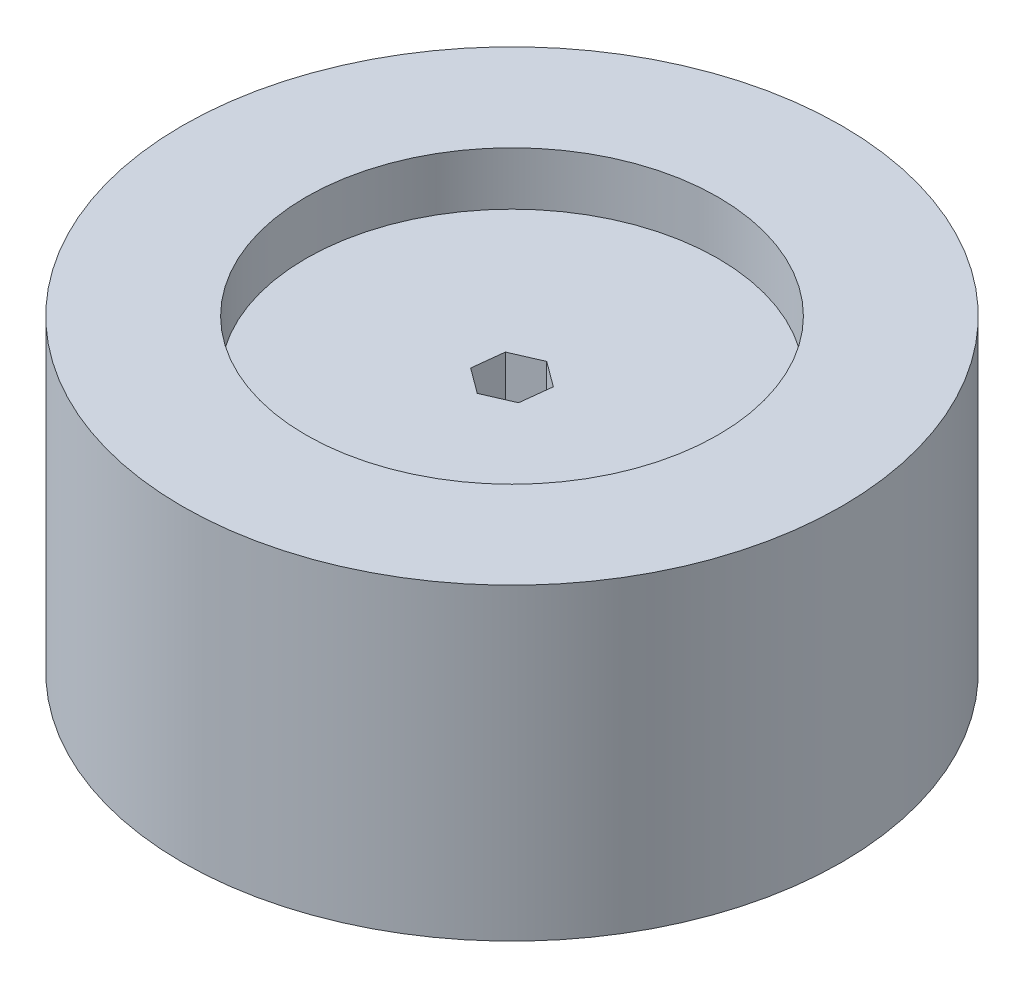
ISO-10303-21;
HEADER;
FILE_DESCRIPTION(('STEP AP214'),'2;1');
FILE_NAME('part.step','',(''),(''),'','','');
FILE_SCHEMA(('AUTOMOTIVE_DESIGN { 1 0 10303 214 1 1 1 1 }'));
ENDSEC;
DATA;
#1=APPLICATION_CONTEXT('core data for automotive mechanical design processes');
#2=APPLICATION_PROTOCOL_DEFINITION('international standard','automotive_design',2000,#1);
#3=PRODUCT_CONTEXT('',#1,'mechanical');
#4=PRODUCT('Part','Part','',(#3));
#5=PRODUCT_RELATED_PRODUCT_CATEGORY('part','',(#4));
#6=PRODUCT_DEFINITION_FORMATION('','',#4);
#7=PRODUCT_DEFINITION_CONTEXT('part definition',#1,'design');
#8=PRODUCT_DEFINITION('design','',#6,#7);
#9=PRODUCT_DEFINITION_SHAPE('','',#8);
#10=(LENGTH_UNIT() NAMED_UNIT(*) SI_UNIT(.MILLI.,.METRE.));
#11=(NAMED_UNIT(*) PLANE_ANGLE_UNIT() SI_UNIT($,.RADIAN.));
#12=(NAMED_UNIT(*) SI_UNIT($,.STERADIAN.) SOLID_ANGLE_UNIT());
#13=UNCERTAINTY_MEASURE_WITH_UNIT(LENGTH_MEASURE(1.E-05),#10,'distance_accuracy_value','');
#14=(GEOMETRIC_REPRESENTATION_CONTEXT(3) GLOBAL_UNCERTAINTY_ASSIGNED_CONTEXT((#13)) GLOBAL_UNIT_ASSIGNED_CONTEXT((#10,
#11,#12)) REPRESENTATION_CONTEXT('',''));
#15=CARTESIAN_POINT('',(0.,0.,0.));
#16=DIRECTION('',(0.,0.,1.));
#17=DIRECTION('',(1.,0.,0.));
#18=AXIS2_PLACEMENT_3D('',#15,#16,#17);
#19=CARTESIAN_POINT('',(3.06476739775482,16.7,2.26433230725068));
#20=DIRECTION('',(-0.993654605654718,0.,-0.112474551171215));
#21=DIRECTION('',(-0.112474551171215,0.,0.993654605654718));
#22=AXIS2_PLACEMENT_3D('',#19,#20,#21);
#23=PLANE('',#22);
#24=DIRECTION('',(0.,-1.,0.));
#25=VECTOR('',#24,1.);
#26=CARTESIAN_POINT('',(3.49335299956633,16.7,-1.52200026952066));
#27=LINE('',#26,#25);
#28=CARTESIAN_POINT('',(3.49335299956633,16.7,-1.52200026952066));
#29=VERTEX_POINT('',#28);
#30=CARTESIAN_POINT('',(3.49335299956633,6.45,-1.52200026952066));
#31=VERTEX_POINT('',#30);
#32=EDGE_CURVE('E135',#29,#31,#27,.T.);
#33=ORIENTED_EDGE('',*,*,#32,.T.);
#34=DIRECTION('',(-0.112474551171215,0.,0.993654605654718));
#35=VECTOR('',#34,1.);
#36=CARTESIAN_POINT('',(3.06476739775482,6.45,2.26433230725068));
#37=LINE('',#36,#35);
#38=CARTESIAN_POINT('',(3.06476739775482,6.45,2.26433230725068));
#39=VERTEX_POINT('',#38);
#40=EDGE_CURVE('E122',#31,#39,#37,.T.);
#41=ORIENTED_EDGE('',*,*,#40,.T.);
#42=DIRECTION('',(0.,-1.,0.));
#43=VECTOR('',#42,1.);
#44=CARTESIAN_POINT('',(3.06476739775482,16.7,2.26433230725068));
#45=LINE('',#44,#43);
#46=CARTESIAN_POINT('',(3.06476739775482,16.7,2.26433230725068));
#47=VERTEX_POINT('',#46);
#48=EDGE_CURVE('E132',#47,#39,#45,.T.);
#49=ORIENTED_EDGE('',*,*,#48,.F.);
#50=DIRECTION('',(0.112474551171215,0.,-0.993654605654718));
#51=VECTOR('',#50,1.);
#52=CARTESIAN_POINT('',(3.06476739775482,16.7,2.26433230725068));
#53=LINE('',#52,#51);
#54=EDGE_CURVE('E136',#47,#29,#53,.T.);
#55=ORIENTED_EDGE('',*,*,#54,.T.);
#56=EDGE_LOOP('',(#33,#41,#49,#55));
#57=FACE_BOUND('',#56,.T.);
#58=ADVANCED_FACE('F34',(#57),#23,.T.);
#59=CARTESIAN_POINT('',(3.49335299956633,16.7,-1.52200026952066));
#60=DIRECTION('',(-0.594233121420884,0.,0.804292855498787));
#61=DIRECTION('',(0.804292855498787,0.,0.594233121420884));
#62=AXIS2_PLACEMENT_3D('',#59,#60,#61);
#63=PLANE('',#62);
#64=DIRECTION('',(0.,-1.,0.));
#65=VECTOR('',#64,1.);
#66=CARTESIAN_POINT('',(0.428585601811509,16.7,-3.78633257677134));
#67=LINE('',#66,#65);
#68=CARTESIAN_POINT('',(0.428585601811509,16.7,-3.78633257677134));
#69=VERTEX_POINT('',#68);
#70=CARTESIAN_POINT('',(0.428585601811509,6.45,-3.78633257677134));
#71=VERTEX_POINT('',#70);
#72=EDGE_CURVE('E215',#69,#71,#67,.T.);
#73=ORIENTED_EDGE('',*,*,#72,.T.);
#74=DIRECTION('',(0.804292855498787,0.,0.594233121420884));
#75=VECTOR('',#74,1.);
#76=CARTESIAN_POINT('',(3.49335299956633,6.45,-1.52200026952066));
#77=LINE('',#76,#75);
#78=EDGE_CURVE('E137',#71,#31,#77,.T.);
#79=ORIENTED_EDGE('',*,*,#78,.T.);
#80=ORIENTED_EDGE('',*,*,#32,.F.);
#81=DIRECTION('',(-0.804292855498787,0.,-0.594233121420884));
#82=VECTOR('',#81,1.);
#83=CARTESIAN_POINT('',(3.49335299956633,16.7,-1.52200026952066));
#84=LINE('',#83,#82);
#85=EDGE_CURVE('E143',#29,#69,#84,.T.);
#86=ORIENTED_EDGE('',*,*,#85,.T.);
#87=EDGE_LOOP('',(#73,#79,#80,#86));
#88=FACE_BOUND('',#87,.T.);
#89=ADVANCED_FACE('F248',(#88),#63,.T.);
#90=CARTESIAN_POINT('',(0.428585601811509,16.7,-3.78633257677134));
#91=DIRECTION('',(0.399421484233834,0.,0.916767406670002));
#92=DIRECTION('',(0.916767406670002,0.,-0.399421484233834));
#93=AXIS2_PLACEMENT_3D('',#90,#91,#92);
#94=PLANE('',#93);
#95=DIRECTION('',(0.,-1.,0.));
#96=VECTOR('',#95,1.);
#97=CARTESIAN_POINT('',(-3.06476739775481,16.7,-2.26433230725068));
#98=LINE('',#97,#96);
#99=CARTESIAN_POINT('',(-3.06476739775481,16.7,-2.26433230725068));
#100=VERTEX_POINT('',#99);
#101=CARTESIAN_POINT('',(-3.06476739775481,6.45,-2.26433230725068));
#102=VERTEX_POINT('',#101);
#103=EDGE_CURVE('E218',#100,#102,#98,.T.);
#104=ORIENTED_EDGE('',*,*,#103,.T.);
#105=DIRECTION('',(0.916767406670002,0.,-0.399421484233834));
#106=VECTOR('',#105,1.);
#107=CARTESIAN_POINT('',(0.428585601811509,6.45,-3.78633257677134));
#108=LINE('',#107,#106);
#109=EDGE_CURVE('E249',#102,#71,#108,.T.);
#110=ORIENTED_EDGE('',*,*,#109,.T.);
#111=ORIENTED_EDGE('',*,*,#72,.F.);
#112=DIRECTION('',(-0.916767406670002,0.,0.399421484233834));
#113=VECTOR('',#112,1.);
#114=CARTESIAN_POINT('',(0.428585601811509,16.7,-3.78633257677134));
#115=LINE('',#114,#113);
#116=EDGE_CURVE('E147',#69,#100,#115,.T.);
#117=ORIENTED_EDGE('',*,*,#116,.T.);
#118=EDGE_LOOP('',(#104,#110,#111,#117));
#119=FACE_BOUND('',#118,.T.);
#120=ADVANCED_FACE('F245',(#119),#94,.T.);
#121=CARTESIAN_POINT('',(-3.06476739775481,16.7,-2.26433230725068));
#122=DIRECTION('',(0.993654605654718,0.,0.112474551171216));
#123=DIRECTION('',(0.112474551171216,0.,-0.993654605654718));
#124=AXIS2_PLACEMENT_3D('',#121,#122,#123);
#125=PLANE('',#124);
#126=DIRECTION('',(0.,-1.,0.));
#127=VECTOR('',#126,1.);
#128=CARTESIAN_POINT('',(-3.49335299956633,16.7,1.52200026952066));
#129=LINE('',#128,#127);
#130=CARTESIAN_POINT('',(-3.49335299956633,16.7,1.52200026952066));
#131=VERTEX_POINT('',#130);
#132=CARTESIAN_POINT('',(-3.49335299956633,6.45,1.52200026952066));
#133=VERTEX_POINT('',#132);
#134=EDGE_CURVE('E145',#131,#133,#129,.T.);
#135=ORIENTED_EDGE('',*,*,#134,.T.);
#136=DIRECTION('',(0.112474551171216,0.,-0.993654605654718));
#137=VECTOR('',#136,1.);
#138=CARTESIAN_POINT('',(-3.06476739775481,6.45,-2.26433230725068));
#139=LINE('',#138,#137);
#140=EDGE_CURVE('E229',#133,#102,#139,.T.);
#141=ORIENTED_EDGE('',*,*,#140,.T.);
#142=ORIENTED_EDGE('',*,*,#103,.F.);
#143=DIRECTION('',(-0.112474551171216,0.,0.993654605654718));
#144=VECTOR('',#143,1.);
#145=CARTESIAN_POINT('',(-3.06476739775481,16.7,-2.26433230725068));
#146=LINE('',#145,#144);
#147=EDGE_CURVE('E231',#100,#131,#146,.T.);
#148=ORIENTED_EDGE('',*,*,#147,.T.);
#149=EDGE_LOOP('',(#135,#141,#142,#148));
#150=FACE_BOUND('',#149,.T.);
#151=ADVANCED_FACE('F227',(#150),#125,.T.);
#152=CARTESIAN_POINT('',(-3.49335299956633,16.7,1.52200026952066));
#153=DIRECTION('',(0.594233121420884,0.,-0.804292855498787));
#154=DIRECTION('',(-0.804292855498787,0.,-0.594233121420885));
#155=AXIS2_PLACEMENT_3D('',#152,#153,#154);
#156=PLANE('',#155);
#157=DIRECTION('',(0.,-1.,0.));
#158=VECTOR('',#157,1.);
#159=CARTESIAN_POINT('',(-0.428585601811509,16.7,3.78633257677134));
#160=LINE('',#159,#158);
#161=CARTESIAN_POINT('',(-0.428585601811509,16.7,3.78633257677134));
#162=VERTEX_POINT('',#161);
#163=CARTESIAN_POINT('',(-0.428585601811509,6.45,3.78633257677134));
#164=VERTEX_POINT('',#163);
#165=EDGE_CURVE('E142',#162,#164,#160,.T.);
#166=ORIENTED_EDGE('',*,*,#165,.T.);
#167=DIRECTION('',(-0.804292855498787,0.,-0.594233121420885));
#168=VECTOR('',#167,1.);
#169=CARTESIAN_POINT('',(-3.49335299956633,6.45,1.52200026952066));
#170=LINE('',#169,#168);
#171=EDGE_CURVE('E49',#164,#133,#170,.T.);
#172=ORIENTED_EDGE('',*,*,#171,.T.);
#173=ORIENTED_EDGE('',*,*,#134,.F.);
#174=DIRECTION('',(0.804292855498787,0.,0.594233121420885));
#175=VECTOR('',#174,1.);
#176=CARTESIAN_POINT('',(-3.49335299956633,16.7,1.52200026952066));
#177=LINE('',#176,#175);
#178=EDGE_CURVE('E235',#131,#162,#177,.T.);
#179=ORIENTED_EDGE('',*,*,#178,.T.);
#180=EDGE_LOOP('',(#166,#172,#173,#179));
#181=FACE_BOUND('',#180,.T.);
#182=ADVANCED_FACE('F234',(#181),#156,.T.);
#183=CARTESIAN_POINT('',(-0.428585601811509,16.7,3.78633257677134));
#184=DIRECTION('',(-0.399421484233834,0.,-0.916767406670002));
#185=DIRECTION('',(-0.916767406670002,0.,0.399421484233834));
#186=AXIS2_PLACEMENT_3D('',#183,#184,#185);
#187=PLANE('',#186);
#188=ORIENTED_EDGE('',*,*,#48,.T.);
#189=DIRECTION('',(-0.916767406670002,0.,0.399421484233834));
#190=VECTOR('',#189,1.);
#191=CARTESIAN_POINT('',(-0.428585601811509,6.45,3.78633257677134));
#192=LINE('',#191,#190);
#193=EDGE_CURVE('E11',#39,#164,#192,.T.);
#194=ORIENTED_EDGE('',*,*,#193,.T.);
#195=ORIENTED_EDGE('',*,*,#165,.F.);
#196=DIRECTION('',(0.916767406670002,0.,-0.399421484233834));
#197=VECTOR('',#196,1.);
#198=CARTESIAN_POINT('',(-0.428585601811509,16.7,3.78633257677134));
#199=LINE('',#198,#197);
#200=EDGE_CURVE('E141',#162,#47,#199,.T.);
#201=ORIENTED_EDGE('',*,*,#200,.T.);
#202=EDGE_LOOP('',(#188,#194,#195,#201));
#203=FACE_BOUND('',#202,.T.);
#204=ADVANCED_FACE('F139',(#203),#187,.T.);
#205=CARTESIAN_POINT('',(0.,0.,0.));
#206=DIRECTION('',(0.,1.,0.));
#207=DIRECTION('',(0.,0.,1.));
#208=AXIS2_PLACEMENT_3D('',#205,#206,#207);
#209=PLANE('',#208);
#210=CARTESIAN_POINT('',(0.,0.,0.));
#211=DIRECTION('',(0.,1.,0.));
#212=DIRECTION('',(0.,0.,1.));
#213=AXIS2_PLACEMENT_3D('',#210,#211,#212);
#214=CIRCLE('',#213,25.);
#215=CARTESIAN_POINT('',(0.,0.,-25.));
#216=VERTEX_POINT('',#215);
#217=EDGE_CURVE('E256',#216,#216,#214,.T.);
#218=ORIENTED_EDGE('',*,*,#217,.T.);
#219=EDGE_LOOP('',(#218));
#220=FACE_BOUND('',#219,.T.);
#221=CARTESIAN_POINT('',(0.,0.,0.));
#222=DIRECTION('',(0.,1.,0.));
#223=DIRECTION('',(0.,0.,1.));
#224=AXIS2_PLACEMENT_3D('',#221,#222,#223);
#225=CIRCLE('',#224,40.);
#226=CARTESIAN_POINT('',(0.,0.,40.));
#227=VERTEX_POINT('',#226);
#228=EDGE_CURVE('E192',#227,#227,#225,.T.);
#229=ORIENTED_EDGE('',*,*,#228,.F.);
#230=EDGE_LOOP('',(#229));
#231=FACE_BOUND('',#230,.T.);
#232=ADVANCED_FACE('F282',(#220,#231),#209,.F.);
#233=CARTESIAN_POINT('',(0.,0.,0.));
#234=DIRECTION('',(0.,1.,0.));
#235=DIRECTION('',(0.,0.,1.));
#236=AXIS2_PLACEMENT_3D('',#233,#234,#235);
#237=CYLINDRICAL_SURFACE('',#236,1.5);
#238=CARTESIAN_POINT('',(0.,20.7,0.));
#239=DIRECTION('',(0.,1.,0.));
#240=DIRECTION('',(0.,0.,1.));
#241=AXIS2_PLACEMENT_3D('',#238,#239,#240);
#242=CIRCLE('',#241,1.5);
#243=CARTESIAN_POINT('',(0.,20.7,1.5));
#244=VERTEX_POINT('',#243);
#245=EDGE_CURVE('E151',#244,#244,#242,.T.);
#246=ORIENTED_EDGE('',*,*,#245,.T.);
#247=EDGE_LOOP('',(#246));
#248=FACE_BOUND('',#247,.T.);
#249=CARTESIAN_POINT('',(0.,16.7,0.));
#250=DIRECTION('',(0.,-1.,0.));
#251=DIRECTION('',(0.,0.,-1.));
#252=AXIS2_PLACEMENT_3D('',#249,#250,#251);
#253=CIRCLE('',#252,1.5);
#254=CARTESIAN_POINT('',(0.,16.7,-1.5));
#255=VERTEX_POINT('',#254);
#256=EDGE_CURVE('E155',#255,#255,#253,.F.);
#257=ORIENTED_EDGE('',*,*,#256,.F.);
#258=EDGE_LOOP('',(#257));
#259=FACE_BOUND('',#258,.T.);
#260=ADVANCED_FACE('F279',(#248,#259),#237,.F.);
#261=CARTESIAN_POINT('',(0.,37.4,0.));
#262=DIRECTION('',(0.,-1.,0.));
#263=DIRECTION('',(0.,0.,-1.));
#264=AXIS2_PLACEMENT_3D('',#261,#262,#263);
#265=CYLINDRICAL_SURFACE('',#264,40.);
#266=CARTESIAN_POINT('',(0.,37.4,0.));
#267=DIRECTION('',(0.,1.,0.));
#268=DIRECTION('',(0.,0.,1.));
#269=AXIS2_PLACEMENT_3D('',#266,#267,#268);
#270=CIRCLE('',#269,40.);
#271=CARTESIAN_POINT('',(0.,37.4,40.));
#272=VERTEX_POINT('',#271);
#273=EDGE_CURVE('E207',#272,#272,#270,.T.);
#274=ORIENTED_EDGE('',*,*,#273,.F.);
#275=EDGE_LOOP('',(#274));
#276=FACE_BOUND('',#275,.T.);
#277=ORIENTED_EDGE('',*,*,#228,.T.);
#278=EDGE_LOOP('',(#277));
#279=FACE_BOUND('',#278,.T.);
#280=ADVANCED_FACE('F36',(#276,#279),#265,.T.);
#281=CARTESIAN_POINT('',(0.,37.4,0.));
#282=DIRECTION('',(0.,1.,0.));
#283=DIRECTION('',(0.,0.,1.));
#284=AXIS2_PLACEMENT_3D('',#281,#282,#283);
#285=PLANE('',#284);
#286=CARTESIAN_POINT('',(0.,37.4,0.));
#287=DIRECTION('',(0.,1.,0.));
#288=DIRECTION('',(0.,0.,1.));
#289=AXIS2_PLACEMENT_3D('',#286,#287,#288);
#290=CIRCLE('',#289,25.);
#291=CARTESIAN_POINT('',(0.,37.4,25.));
#292=VERTEX_POINT('',#291);
#293=EDGE_CURVE('E154',#292,#292,#290,.T.);
#294=ORIENTED_EDGE('',*,*,#293,.F.);
#295=EDGE_LOOP('',(#294));
#296=FACE_BOUND('',#295,.T.);
#297=ORIENTED_EDGE('',*,*,#273,.T.);
#298=EDGE_LOOP('',(#297));
#299=FACE_BOUND('',#298,.T.);
#300=ADVANCED_FACE('F288',(#296,#299),#285,.T.);
#301=CARTESIAN_POINT('',(0.,30.95,0.));
#302=DIRECTION('',(0.,1.,0.));
#303=DIRECTION('',(0.,0.,1.));
#304=AXIS2_PLACEMENT_3D('',#301,#302,#303);
#305=PLANE('',#304);
#306=CARTESIAN_POINT('',(0.,30.95,0.));
#307=DIRECTION('',(0.,1.,0.));
#308=DIRECTION('',(0.,0.,1.));
#309=AXIS2_PLACEMENT_3D('',#306,#307,#308);
#310=CIRCLE('',#309,25.);
#311=CARTESIAN_POINT('',(0.,30.95,25.));
#312=VERTEX_POINT('',#311);
#313=EDGE_CURVE('E156',#312,#312,#310,.T.);
#314=ORIENTED_EDGE('',*,*,#313,.T.);
#315=EDGE_LOOP('',(#314));
#316=FACE_BOUND('',#315,.T.);
#317=DIRECTION('',(-0.112474551171215,0.,0.993654605654718));
#318=VECTOR('',#317,1.);
#319=CARTESIAN_POINT('',(3.06476739775482,30.95,2.26433230725068));
#320=LINE('',#319,#318);
#321=CARTESIAN_POINT('',(3.49335299956633,30.95,-1.52200026952066));
#322=VERTEX_POINT('',#321);
#323=CARTESIAN_POINT('',(3.06476739775482,30.95,2.26433230725068));
#324=VERTEX_POINT('',#323);
#325=EDGE_CURVE('E168',#322,#324,#320,.T.);
#326=ORIENTED_EDGE('',*,*,#325,.T.);
#327=DIRECTION('',(-0.916767406670002,0.,0.399421484233834));
#328=VECTOR('',#327,1.);
#329=CARTESIAN_POINT('',(-0.428585601811509,30.95,3.78633257677134));
#330=LINE('',#329,#328);
#331=CARTESIAN_POINT('',(-0.428585601811509,30.95,3.78633257677134));
#332=VERTEX_POINT('',#331);
#333=EDGE_CURVE('E166',#324,#332,#330,.T.);
#334=ORIENTED_EDGE('',*,*,#333,.T.);
#335=DIRECTION('',(-0.804292855498787,0.,-0.594233121420885));
#336=VECTOR('',#335,1.);
#337=CARTESIAN_POINT('',(-3.49335299956633,30.95,1.52200026952066));
#338=LINE('',#337,#336);
#339=CARTESIAN_POINT('',(-3.49335299956633,30.95,1.52200026952066));
#340=VERTEX_POINT('',#339);
#341=EDGE_CURVE('E164',#332,#340,#338,.T.);
#342=ORIENTED_EDGE('',*,*,#341,.T.);
#343=DIRECTION('',(0.112474551171216,0.,-0.993654605654718));
#344=VECTOR('',#343,1.);
#345=CARTESIAN_POINT('',(-3.06476739775481,30.95,-2.26433230725068));
#346=LINE('',#345,#344);
#347=CARTESIAN_POINT('',(-3.06476739775481,30.95,-2.26433230725068));
#348=VERTEX_POINT('',#347);
#349=EDGE_CURVE('E162',#340,#348,#346,.T.);
#350=ORIENTED_EDGE('',*,*,#349,.T.);
#351=DIRECTION('',(0.916767406670002,0.,-0.399421484233834));
#352=VECTOR('',#351,1.);
#353=CARTESIAN_POINT('',(0.428585601811509,30.95,-3.78633257677134));
#354=LINE('',#353,#352);
#355=CARTESIAN_POINT('',(0.428585601811509,30.95,-3.78633257677134));
#356=VERTEX_POINT('',#355);
#357=EDGE_CURVE('E56',#348,#356,#354,.T.);
#358=ORIENTED_EDGE('',*,*,#357,.T.);
#359=DIRECTION('',(0.804292855498787,0.,0.594233121420884));
#360=VECTOR('',#359,1.);
#361=CARTESIAN_POINT('',(3.49335299956633,30.95,-1.52200026952066));
#362=LINE('',#361,#360);
#363=EDGE_CURVE('E42',#356,#322,#362,.T.);
#364=ORIENTED_EDGE('',*,*,#363,.T.);
#365=EDGE_LOOP('',(#326,#334,#342,#350,#358,#364));
#366=FACE_BOUND('',#365,.T.);
#367=ADVANCED_FACE('F284',(#316,#366),#305,.T.);
#368=CARTESIAN_POINT('',(0.,30.95,0.));
#369=DIRECTION('',(0.,1.,0.));
#370=DIRECTION('',(0.,0.,1.));
#371=AXIS2_PLACEMENT_3D('',#368,#369,#370);
#372=CYLINDRICAL_SURFACE('',#371,25.);
#373=CARTESIAN_POINT('',(0.,30.95,25.));
#374=CARTESIAN_POINT('',(0.,31.0171875,25.));
#375=CARTESIAN_POINT('',(0.,31.084375,25.));
#376=CARTESIAN_POINT('',(0.,31.21875,25.));
#377=CARTESIAN_POINT('',(0.,31.2859375,25.));
#378=CARTESIAN_POINT('',(0.,31.4203125,25.));
#379=CARTESIAN_POINT('',(0.,31.4875,25.));
#380=CARTESIAN_POINT('',(0.,31.621875,25.));
#381=CARTESIAN_POINT('',(0.,31.6890625,25.));
#382=CARTESIAN_POINT('',(0.,31.8234375,25.));
#383=CARTESIAN_POINT('',(0.,31.890625,25.));
#384=CARTESIAN_POINT('',(0.,32.025,25.));
#385=CARTESIAN_POINT('',(0.,32.0921875,25.));
#386=CARTESIAN_POINT('',(0.,32.2265625,25.));
#387=CARTESIAN_POINT('',(0.,32.29375,25.));
#388=CARTESIAN_POINT('',(0.,32.428125,25.));
#389=CARTESIAN_POINT('',(0.,32.4953125,25.));
#390=CARTESIAN_POINT('',(0.,32.6296875,25.));
#391=CARTESIAN_POINT('',(0.,32.696875,25.));
#392=CARTESIAN_POINT('',(0.,32.83125,25.));
#393=CARTESIAN_POINT('',(0.,32.8984375,25.));
#394=CARTESIAN_POINT('',(0.,33.0328125,25.));
#395=CARTESIAN_POINT('',(0.,33.1,25.));
#396=CARTESIAN_POINT('',(0.,33.234375,25.));
#397=CARTESIAN_POINT('',(0.,33.3015625,25.));
#398=CARTESIAN_POINT('',(0.,33.4359375,25.));
#399=CARTESIAN_POINT('',(0.,33.503125,25.));
#400=CARTESIAN_POINT('',(0.,33.6375,25.));
#401=CARTESIAN_POINT('',(0.,33.7046875,25.));
#402=CARTESIAN_POINT('',(0.,33.8390625,25.));
#403=CARTESIAN_POINT('',(0.,33.90625,25.));
#404=CARTESIAN_POINT('',(0.,34.040625,25.));
#405=CARTESIAN_POINT('',(0.,34.1078125,25.));
#406=CARTESIAN_POINT('',(0.,34.2421875,25.));
#407=CARTESIAN_POINT('',(0.,34.309375,25.));
#408=CARTESIAN_POINT('',(0.,34.44375,25.));
#409=CARTESIAN_POINT('',(0.,34.5109375,25.));
#410=CARTESIAN_POINT('',(0.,34.6453125,25.));
#411=CARTESIAN_POINT('',(0.,34.7125,25.));
#412=CARTESIAN_POINT('',(0.,34.846875,25.));
#413=CARTESIAN_POINT('',(0.,34.9140625,25.));
#414=CARTESIAN_POINT('',(0.,35.0484375,25.));
#415=CARTESIAN_POINT('',(0.,35.115625,25.));
#416=CARTESIAN_POINT('',(0.,35.25,25.));
#417=CARTESIAN_POINT('',(0.,35.3171875,25.));
#418=CARTESIAN_POINT('',(0.,35.4515625,25.));
#419=CARTESIAN_POINT('',(0.,35.51875,25.));
#420=CARTESIAN_POINT('',(0.,35.653125,25.));
#421=CARTESIAN_POINT('',(0.,35.7203125,25.));
#422=CARTESIAN_POINT('',(0.,35.8546875,25.));
#423=CARTESIAN_POINT('',(0.,35.921875,25.));
#424=CARTESIAN_POINT('',(0.,36.05625,25.));
#425=CARTESIAN_POINT('',(0.,36.1234375,25.));
#426=CARTESIAN_POINT('',(0.,36.2578125,25.));
#427=CARTESIAN_POINT('',(0.,36.325,25.));
#428=CARTESIAN_POINT('',(0.,36.459375,25.));
#429=CARTESIAN_POINT('',(0.,36.5265625,25.));
#430=CARTESIAN_POINT('',(0.,36.6609375,25.));
#431=CARTESIAN_POINT('',(0.,36.728125,25.));
#432=CARTESIAN_POINT('',(0.,36.8625,25.));
#433=CARTESIAN_POINT('',(0.,36.9296875,25.));
#434=CARTESIAN_POINT('',(0.,37.0640625,25.));
#435=CARTESIAN_POINT('',(0.,37.13125,25.));
#436=CARTESIAN_POINT('',(0.,37.265625,25.));
#437=CARTESIAN_POINT('',(0.,37.3328125,25.));
#438=CARTESIAN_POINT('',(0.,37.4,25.));
#439=B_SPLINE_CURVE_WITH_KNOTS('',3,(#373,#374,#375,#376,#377,#378,#379,#380,#381,#382,#383,
#384,#385,#386,#387,#388,#389,#390,#391,#392,#393,#394,#395,#396,#397,#398,#399,#400,#401,#402,
#403,#404,#405,#406,#407,#408,#409,#410,#411,#412,#413,#414,#415,#416,#417,#418,#419,#420,#421,
#422,#423,#424,#425,#426,#427,#428,#429,#430,#431,#432,#433,#434,#435,#436,#437,#438),
.UNSPECIFIED.,.F.,.F.,(4,2,2,2,2,2,2,2,2,2,2,2,2,2,2,2,2,2,2,2,2,2,2,2,2,2,2,2,2,2,2,2,4),(0.,
0.201562499999999,0.403125000000001,0.604687499999996,0.806249999999998,1.0078125,1.209375,
1.4109375,1.6125,1.8140625,2.015625,2.2171875,2.41875,2.6203125,2.821875,3.0234375,3.225,
3.4265625,3.628125,3.8296875,4.03125,4.2328125,4.434375,4.6359375,4.8375,5.0390625,5.240625,
5.4421875,5.64375,5.8453125,6.046875,6.2484375,6.45),.UNSPECIFIED.);
#440=EDGE_CURVE('BSEAM287',#312,#292,#439,.T.);
#441=ORIENTED_EDGE('',*,*,#313,.F.);
#442=ORIENTED_EDGE('',*,*,#293,.T.);
#443=ORIENTED_EDGE('',*,*,#440,.T.);
#444=ORIENTED_EDGE('',*,*,#440,.F.);
#445=EDGE_LOOP('',(#441,#443,#442,#444));
#446=FACE_BOUND('',#445,.T.);
#447=ADVANCED_FACE('F287',(#446),#372,.F.);
#448=CARTESIAN_POINT('',(0.,20.7,0.));
#449=DIRECTION('',(0.,1.,0.));
#450=DIRECTION('',(0.,0.,1.));
#451=AXIS2_PLACEMENT_3D('',#448,#449,#450);
#452=PLANE('',#451);
#453=ORIENTED_EDGE('',*,*,#245,.F.);
#454=EDGE_LOOP('',(#453));
#455=FACE_BOUND('',#454,.T.);
#456=DIRECTION('',(0.112474551171215,0.,-0.993654605654718));
#457=VECTOR('',#456,1.);
#458=CARTESIAN_POINT('',(3.06476739775482,20.7,2.26433230725068));
#459=LINE('',#458,#457);
#460=CARTESIAN_POINT('',(3.06476739775482,20.7,2.26433230725068));
#461=VERTEX_POINT('',#460);
#462=CARTESIAN_POINT('',(3.49335299956633,20.7,-1.52200026952066));
#463=VERTEX_POINT('',#462);
#464=EDGE_CURVE('E170',#461,#463,#459,.T.);
#465=ORIENTED_EDGE('',*,*,#464,.T.);
#466=DIRECTION('',(-0.804292855498787,0.,-0.594233121420884));
#467=VECTOR('',#466,1.);
#468=CARTESIAN_POINT('',(3.49335299956633,20.7,-1.52200026952066));
#469=LINE('',#468,#467);
#470=CARTESIAN_POINT('',(0.428585601811509,20.7,-3.78633257677134));
#471=VERTEX_POINT('',#470);
#472=EDGE_CURVE('E173',#463,#471,#469,.T.);
#473=ORIENTED_EDGE('',*,*,#472,.T.);
#474=DIRECTION('',(-0.916767406670002,0.,0.399421484233834));
#475=VECTOR('',#474,1.);
#476=CARTESIAN_POINT('',(0.428585601811509,20.7,-3.78633257677134));
#477=LINE('',#476,#475);
#478=CARTESIAN_POINT('',(-3.06476739775481,20.7,-2.26433230725068));
#479=VERTEX_POINT('',#478);
#480=EDGE_CURVE('E176',#471,#479,#477,.T.);
#481=ORIENTED_EDGE('',*,*,#480,.T.);
#482=DIRECTION('',(-0.112474551171216,0.,0.993654605654718));
#483=VECTOR('',#482,1.);
#484=CARTESIAN_POINT('',(-3.06476739775481,20.7,-2.26433230725068));
#485=LINE('',#484,#483);
#486=CARTESIAN_POINT('',(-3.49335299956633,20.7,1.52200026952066));
#487=VERTEX_POINT('',#486);
#488=EDGE_CURVE('E179',#479,#487,#485,.T.);
#489=ORIENTED_EDGE('',*,*,#488,.T.);
#490=DIRECTION('',(0.804292855498787,0.,0.594233121420885));
#491=VECTOR('',#490,1.);
#492=CARTESIAN_POINT('',(-3.49335299956633,20.7,1.52200026952066));
#493=LINE('',#492,#491);
#494=CARTESIAN_POINT('',(-0.428585601811509,20.7,3.78633257677134));
#495=VERTEX_POINT('',#494);
#496=EDGE_CURVE('E182',#487,#495,#493,.T.);
#497=ORIENTED_EDGE('',*,*,#496,.T.);
#498=DIRECTION('',(0.916767406670002,0.,-0.399421484233834));
#499=VECTOR('',#498,1.);
#500=CARTESIAN_POINT('',(-0.428585601811509,20.7,3.78633257677134));
#501=LINE('',#500,#499);
#502=EDGE_CURVE('E185',#495,#461,#501,.T.);
#503=ORIENTED_EDGE('',*,*,#502,.T.);
#504=EDGE_LOOP('',(#465,#473,#481,#489,#497,#503));
#505=FACE_BOUND('',#504,.T.);
#506=ADVANCED_FACE('F292',(#455,#505),#452,.T.);
#507=CARTESIAN_POINT('',(3.49335299956633,20.7,-1.52200026952066));
#508=DIRECTION('',(0.594233121420884,0.,-0.804292855498787));
#509=DIRECTION('',(-0.804292855498787,0.,-0.594233121420884));
#510=AXIS2_PLACEMENT_3D('',#507,#508,#509);
#511=PLANE('',#510);
#512=ORIENTED_EDGE('',*,*,#363,.F.);
#513=DIRECTION('',(0.,1.,0.));
#514=VECTOR('',#513,1.);
#515=CARTESIAN_POINT('',(0.428585601811509,20.7,-3.78633257677134));
#516=LINE('',#515,#514);
#517=EDGE_CURVE('E202',#471,#356,#516,.T.);
#518=ORIENTED_EDGE('',*,*,#517,.F.);
#519=ORIENTED_EDGE('',*,*,#472,.F.);
#520=DIRECTION('',(0.,1.,0.));
#521=VECTOR('',#520,1.);
#522=CARTESIAN_POINT('',(3.49335299956633,20.7,-1.52200026952066));
#523=LINE('',#522,#521);
#524=EDGE_CURVE('E188',#463,#322,#523,.T.);
#525=ORIENTED_EDGE('',*,*,#524,.T.);
#526=EDGE_LOOP('',(#512,#518,#519,#525));
#527=FACE_BOUND('',#526,.T.);
#528=ADVANCED_FACE('F296',(#527),#511,.F.);
#529=CARTESIAN_POINT('',(0.428585601811509,20.7,-3.78633257677134));
#530=DIRECTION('',(-0.399421484233834,0.,-0.916767406670002));
#531=DIRECTION('',(-0.916767406670002,0.,0.399421484233834));
#532=AXIS2_PLACEMENT_3D('',#529,#530,#531);
#533=PLANE('',#532);
#534=ORIENTED_EDGE('',*,*,#357,.F.);
#535=DIRECTION('',(0.,1.,0.));
#536=VECTOR('',#535,1.);
#537=CARTESIAN_POINT('',(-3.06476739775481,20.7,-2.26433230725068));
#538=LINE('',#537,#536);
#539=EDGE_CURVE('E199',#479,#348,#538,.T.);
#540=ORIENTED_EDGE('',*,*,#539,.F.);
#541=ORIENTED_EDGE('',*,*,#480,.F.);
#542=ORIENTED_EDGE('',*,*,#517,.T.);
#543=EDGE_LOOP('',(#534,#540,#541,#542));
#544=FACE_BOUND('',#543,.T.);
#545=ADVANCED_FACE('F310',(#544),#533,.F.);
#546=CARTESIAN_POINT('',(-3.06476739775481,20.7,-2.26433230725068));
#547=DIRECTION('',(-0.993654605654718,0.,-0.112474551171216));
#548=DIRECTION('',(-0.112474551171216,0.,0.993654605654718));
#549=AXIS2_PLACEMENT_3D('',#546,#547,#548);
#550=PLANE('',#549);
#551=ORIENTED_EDGE('',*,*,#349,.F.);
#552=DIRECTION('',(0.,1.,0.));
#553=VECTOR('',#552,1.);
#554=CARTESIAN_POINT('',(-3.49335299956633,20.7,1.52200026952066));
#555=LINE('',#554,#553);
#556=EDGE_CURVE('E196',#487,#340,#555,.T.);
#557=ORIENTED_EDGE('',*,*,#556,.F.);
#558=ORIENTED_EDGE('',*,*,#488,.F.);
#559=ORIENTED_EDGE('',*,*,#539,.T.);
#560=EDGE_LOOP('',(#551,#557,#558,#559));
#561=FACE_BOUND('',#560,.T.);
#562=ADVANCED_FACE('F306',(#561),#550,.F.);
#563=CARTESIAN_POINT('',(-3.49335299956633,20.7,1.52200026952066));
#564=DIRECTION('',(-0.594233121420884,0.,0.804292855498787));
#565=DIRECTION('',(0.804292855498787,0.,0.594233121420885));
#566=AXIS2_PLACEMENT_3D('',#563,#564,#565);
#567=PLANE('',#566);
#568=ORIENTED_EDGE('',*,*,#341,.F.);
#569=DIRECTION('',(0.,1.,0.));
#570=VECTOR('',#569,1.);
#571=CARTESIAN_POINT('',(-0.428585601811509,20.7,3.78633257677134));
#572=LINE('',#571,#570);
#573=EDGE_CURVE('E193',#495,#332,#572,.T.);
#574=ORIENTED_EDGE('',*,*,#573,.F.);
#575=ORIENTED_EDGE('',*,*,#496,.F.);
#576=ORIENTED_EDGE('',*,*,#556,.T.);
#577=EDGE_LOOP('',(#568,#574,#575,#576));
#578=FACE_BOUND('',#577,.T.);
#579=ADVANCED_FACE('F302',(#578),#567,.F.);
#580=CARTESIAN_POINT('',(-0.428585601811509,20.7,3.78633257677134));
#581=DIRECTION('',(0.399421484233834,0.,0.916767406670002));
#582=DIRECTION('',(0.916767406670002,0.,-0.399421484233834));
#583=AXIS2_PLACEMENT_3D('',#580,#581,#582);
#584=PLANE('',#583);
#585=ORIENTED_EDGE('',*,*,#333,.F.);
#586=DIRECTION('',(0.,1.,0.));
#587=VECTOR('',#586,1.);
#588=CARTESIAN_POINT('',(3.06476739775482,20.7,2.26433230725068));
#589=LINE('',#588,#587);
#590=EDGE_CURVE('E189',#461,#324,#589,.T.);
#591=ORIENTED_EDGE('',*,*,#590,.F.);
#592=ORIENTED_EDGE('',*,*,#502,.F.);
#593=ORIENTED_EDGE('',*,*,#573,.T.);
#594=EDGE_LOOP('',(#585,#591,#592,#593));
#595=FACE_BOUND('',#594,.T.);
#596=ADVANCED_FACE('F298',(#595),#584,.F.);
#597=CARTESIAN_POINT('',(3.06476739775482,20.7,2.26433230725068));
#598=DIRECTION('',(0.993654605654718,0.,0.112474551171215));
#599=DIRECTION('',(0.112474551171215,0.,-0.993654605654718));
#600=AXIS2_PLACEMENT_3D('',#597,#598,#599);
#601=PLANE('',#600);
#602=ORIENTED_EDGE('',*,*,#325,.F.);
#603=ORIENTED_EDGE('',*,*,#524,.F.);
#604=ORIENTED_EDGE('',*,*,#464,.F.);
#605=ORIENTED_EDGE('',*,*,#590,.T.);
#606=EDGE_LOOP('',(#602,#603,#604,#605));
#607=FACE_BOUND('',#606,.T.);
#608=ADVANCED_FACE('F301',(#607),#601,.F.);
#609=CARTESIAN_POINT('',(0.,16.7,0.));
#610=DIRECTION('',(0.,-1.,0.));
#611=DIRECTION('',(0.,0.,1.));
#612=AXIS2_PLACEMENT_3D('',#609,#610,#611);
#613=PLANE('',#612);
#614=ORIENTED_EDGE('',*,*,#54,.F.);
#615=ORIENTED_EDGE('',*,*,#200,.F.);
#616=ORIENTED_EDGE('',*,*,#178,.F.);
#617=ORIENTED_EDGE('',*,*,#147,.F.);
#618=ORIENTED_EDGE('',*,*,#116,.F.);
#619=ORIENTED_EDGE('',*,*,#85,.F.);
#620=EDGE_LOOP('',(#614,#615,#616,#617,#618,#619));
#621=FACE_BOUND('',#620,.T.);
#622=ORIENTED_EDGE('',*,*,#256,.T.);
#623=EDGE_LOOP('',(#622));
#624=FACE_BOUND('',#623,.T.);
#625=ADVANCED_FACE('F237',(#621,#624),#613,.T.);
#626=CARTESIAN_POINT('',(0.,6.45,0.));
#627=DIRECTION('',(0.,-1.,0.));
#628=DIRECTION('',(0.,0.,-1.));
#629=AXIS2_PLACEMENT_3D('',#626,#627,#628);
#630=CYLINDRICAL_SURFACE('',#629,25.);
#631=CARTESIAN_POINT('',(0.,6.45,0.));
#632=DIRECTION('',(0.,1.,0.));
#633=DIRECTION('',(0.,0.,1.));
#634=AXIS2_PLACEMENT_3D('',#631,#632,#633);
#635=CIRCLE('',#634,25.);
#636=CARTESIAN_POINT('',(0.,6.45,-25.));
#637=VERTEX_POINT('',#636);
#638=EDGE_CURVE('E255',#637,#637,#635,.T.);
#639=CARTESIAN_POINT('',(0.,6.45,-25.));
#640=CARTESIAN_POINT('',(0.,6.3828125,-25.));
#641=CARTESIAN_POINT('',(0.,6.315625,-25.));
#642=CARTESIAN_POINT('',(0.,6.18125,-25.));
#643=CARTESIAN_POINT('',(0.,6.1140625,-25.));
#644=CARTESIAN_POINT('',(0.,5.9796875,-25.));
#645=CARTESIAN_POINT('',(0.,5.9125,-25.));
#646=CARTESIAN_POINT('',(0.,5.778125,-25.));
#647=CARTESIAN_POINT('',(0.,5.7109375,-25.));
#648=CARTESIAN_POINT('',(0.,5.5765625,-25.));
#649=CARTESIAN_POINT('',(0.,5.509375,-25.));
#650=CARTESIAN_POINT('',(0.,5.375,-25.));
#651=CARTESIAN_POINT('',(0.,5.3078125,-25.));
#652=CARTESIAN_POINT('',(0.,5.1734375,-25.));
#653=CARTESIAN_POINT('',(0.,5.10625,-25.));
#654=CARTESIAN_POINT('',(0.,4.971875,-25.));
#655=CARTESIAN_POINT('',(0.,4.9046875,-25.));
#656=CARTESIAN_POINT('',(0.,4.7703125,-25.));
#657=CARTESIAN_POINT('',(0.,4.703125,-25.));
#658=CARTESIAN_POINT('',(0.,4.56875,-25.));
#659=CARTESIAN_POINT('',(0.,4.5015625,-25.));
#660=CARTESIAN_POINT('',(0.,4.3671875,-25.));
#661=CARTESIAN_POINT('',(0.,4.3,-25.));
#662=CARTESIAN_POINT('',(0.,4.165625,-25.));
#663=CARTESIAN_POINT('',(0.,4.0984375,-25.));
#664=CARTESIAN_POINT('',(0.,3.9640625,-25.));
#665=CARTESIAN_POINT('',(0.,3.896875,-25.));
#666=CARTESIAN_POINT('',(0.,3.7625,-25.));
#667=CARTESIAN_POINT('',(0.,3.6953125,-25.));
#668=CARTESIAN_POINT('',(0.,3.5609375,-25.));
#669=CARTESIAN_POINT('',(0.,3.49375,-25.));
#670=CARTESIAN_POINT('',(0.,3.359375,-25.));
#671=CARTESIAN_POINT('',(0.,3.2921875,-25.));
#672=CARTESIAN_POINT('',(0.,3.1578125,-25.));
#673=CARTESIAN_POINT('',(0.,3.090625,-25.));
#674=CARTESIAN_POINT('',(0.,2.95625,-25.));
#675=CARTESIAN_POINT('',(0.,2.8890625,-25.));
#676=CARTESIAN_POINT('',(0.,2.7546875,-25.));
#677=CARTESIAN_POINT('',(0.,2.6875,-25.));
#678=CARTESIAN_POINT('',(0.,2.553125,-25.));
#679=CARTESIAN_POINT('',(0.,2.4859375,-25.));
#680=CARTESIAN_POINT('',(0.,2.3515625,-25.));
#681=CARTESIAN_POINT('',(0.,2.284375,-25.));
#682=CARTESIAN_POINT('',(0.,2.15,-25.));
#683=CARTESIAN_POINT('',(0.,2.0828125,-25.));
#684=CARTESIAN_POINT('',(0.,1.9484375,-25.));
#685=CARTESIAN_POINT('',(0.,1.88125,-25.));
#686=CARTESIAN_POINT('',(0.,1.746875,-25.));
#687=CARTESIAN_POINT('',(0.,1.6796875,-25.));
#688=CARTESIAN_POINT('',(0.,1.5453125,-25.));
#689=CARTESIAN_POINT('',(0.,1.478125,-25.));
#690=CARTESIAN_POINT('',(0.,1.34375,-25.));
#691=CARTESIAN_POINT('',(0.,1.2765625,-25.));
#692=CARTESIAN_POINT('',(0.,1.1421875,-25.));
#693=CARTESIAN_POINT('',(0.,1.075,-25.));
#694=CARTESIAN_POINT('',(0.,0.940625,-25.));
#695=CARTESIAN_POINT('',(0.,0.8734375,-25.));
#696=CARTESIAN_POINT('',(0.,0.7390625,-25.));
#697=CARTESIAN_POINT('',(0.,0.671875,-25.));
#698=CARTESIAN_POINT('',(0.,0.5375,-25.));
#699=CARTESIAN_POINT('',(0.,0.4703125,-25.));
#700=CARTESIAN_POINT('',(0.,0.3359375,-25.));
#701=CARTESIAN_POINT('',(0.,0.26875,-25.));
#702=CARTESIAN_POINT('',(0.,0.134375,-25.));
#703=CARTESIAN_POINT('',(0.,0.0671875000000002,-25.));
#704=CARTESIAN_POINT('',(0.,0.,-25.));
#705=B_SPLINE_CURVE_WITH_KNOTS('',3,(#639,#640,#641,#642,#643,#644,#645,#646,#647,#648,#649,
#650,#651,#652,#653,#654,#655,#656,#657,#658,#659,#660,#661,#662,#663,#664,#665,#666,#667,#668,
#669,#670,#671,#672,#673,#674,#675,#676,#677,#678,#679,#680,#681,#682,#683,#684,#685,#686,#687,
#688,#689,#690,#691,#692,#693,#694,#695,#696,#697,#698,#699,#700,#701,#702,#703,#704),
.UNSPECIFIED.,.F.,.F.,(4,2,2,2,2,2,2,2,2,2,2,2,2,2,2,2,2,2,2,2,2,2,2,2,2,2,2,2,2,2,2,2,4),(0.,
0.201562499999999,0.403125,0.604687499999999,0.80625,1.0078125,1.209375,1.4109375,1.6125,
1.8140625,2.015625,2.2171875,2.41875,2.6203125,2.821875,3.0234375,3.225,3.4265625,3.628125,
3.8296875,4.03125,4.2328125,4.434375,4.6359375,4.8375,5.0390625,5.240625,5.4421875,5.64375,
5.8453125,6.046875,6.2484375,6.45),.UNSPECIFIED.);
#706=EDGE_CURVE('BSEAM262',#637,#216,#705,.T.);
#707=ORIENTED_EDGE('',*,*,#638,.T.);
#708=ORIENTED_EDGE('',*,*,#217,.F.);
#709=ORIENTED_EDGE('',*,*,#706,.T.);
#710=ORIENTED_EDGE('',*,*,#706,.F.);
#711=EDGE_LOOP('',(#707,#709,#708,#710));
#712=FACE_BOUND('',#711,.T.);
#713=ADVANCED_FACE('F262',(#712),#630,.F.);
#714=CARTESIAN_POINT('',(0.,6.45,0.));
#715=DIRECTION('',(0.,-1.,0.));
#716=DIRECTION('',(0.,0.,1.));
#717=AXIS2_PLACEMENT_3D('',#714,#715,#716);
#718=PLANE('',#717);
#719=ORIENTED_EDGE('',*,*,#78,.F.);
#720=ORIENTED_EDGE('',*,*,#109,.F.);
#721=ORIENTED_EDGE('',*,*,#140,.F.);
#722=ORIENTED_EDGE('',*,*,#171,.F.);
#723=ORIENTED_EDGE('',*,*,#193,.F.);
#724=ORIENTED_EDGE('',*,*,#40,.F.);
#725=EDGE_LOOP('',(#719,#720,#721,#722,#723,#724));
#726=FACE_BOUND('',#725,.T.);
#727=ORIENTED_EDGE('',*,*,#638,.F.);
#728=EDGE_LOOP('',(#727));
#729=FACE_BOUND('',#728,.T.);
#730=ADVANCED_FACE('F120',(#726,#729),#718,.T.);
#731=CLOSED_SHELL('',(#58,#89,#120,#151,#182,#204,#232,#260,#280,#300,#367,#447,#506,#528,#545,
#562,#579,#596,#608,#625,#713,#730));
#732=MANIFOLD_SOLID_BREP('B2',#731);
#733=ADVANCED_BREP_SHAPE_REPRESENTATION('',(#18,#732),#14);
#734=SHAPE_DEFINITION_REPRESENTATION(#9,#733);
ENDSEC;
END-ISO-10303-21;
